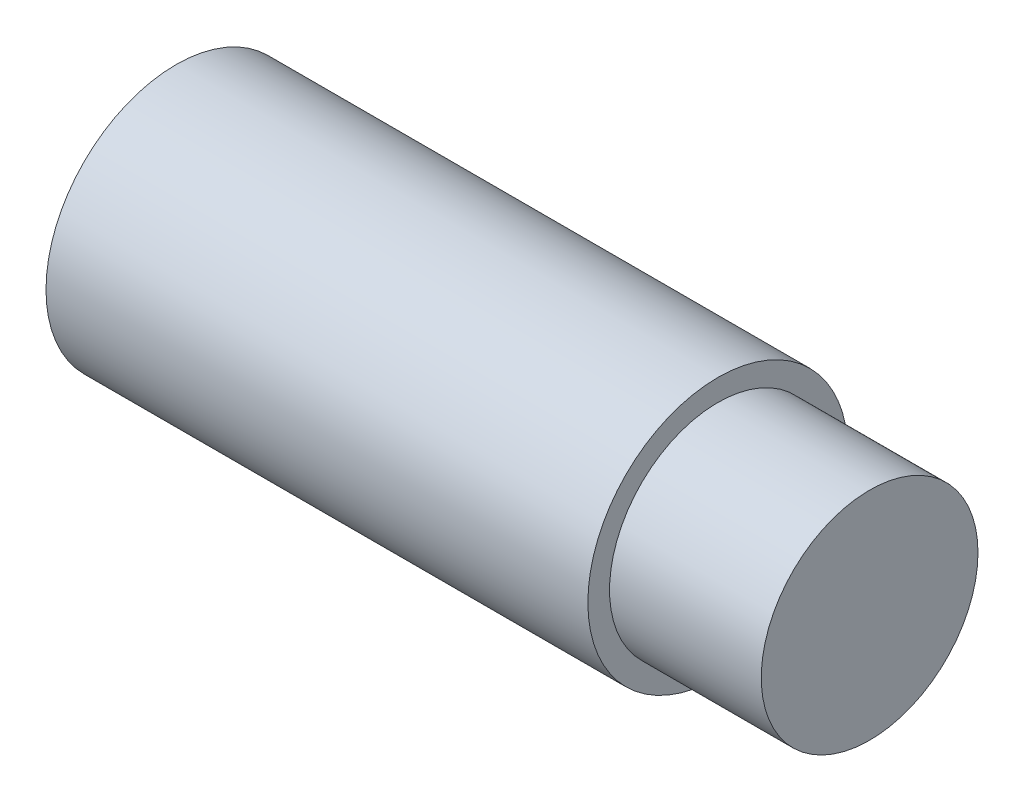
ISO-10303-21;
HEADER;
FILE_DESCRIPTION(('STEP AP214'),'2;1');
FILE_NAME('part.step','',(''),(''),'','','');
FILE_SCHEMA(('AUTOMOTIVE_DESIGN { 1 0 10303 214 1 1 1 1 }'));
ENDSEC;
DATA;
#1=APPLICATION_CONTEXT('core data for automotive mechanical design processes');
#2=APPLICATION_PROTOCOL_DEFINITION('international standard','automotive_design',2000,#1);
#3=PRODUCT_CONTEXT('',#1,'mechanical');
#4=PRODUCT('Part','Part','',(#3));
#5=PRODUCT_RELATED_PRODUCT_CATEGORY('part','',(#4));
#6=PRODUCT_DEFINITION_FORMATION('','',#4);
#7=PRODUCT_DEFINITION_CONTEXT('part definition',#1,'design');
#8=PRODUCT_DEFINITION('design','',#6,#7);
#9=PRODUCT_DEFINITION_SHAPE('','',#8);
#10=(LENGTH_UNIT() NAMED_UNIT(*) SI_UNIT(.MILLI.,.METRE.));
#11=(NAMED_UNIT(*) PLANE_ANGLE_UNIT() SI_UNIT($,.RADIAN.));
#12=(NAMED_UNIT(*) SI_UNIT($,.STERADIAN.) SOLID_ANGLE_UNIT());
#13=UNCERTAINTY_MEASURE_WITH_UNIT(LENGTH_MEASURE(1.E-05),#10,'distance_accuracy_value','');
#14=(GEOMETRIC_REPRESENTATION_CONTEXT(3) GLOBAL_UNCERTAINTY_ASSIGNED_CONTEXT((#13)) GLOBAL_UNIT_ASSIGNED_CONTEXT((#10,
#11,#12)) REPRESENTATION_CONTEXT('',''));
#15=CARTESIAN_POINT('',(0.,0.,0.));
#16=DIRECTION('',(0.,0.,1.));
#17=DIRECTION('',(1.,0.,0.));
#18=AXIS2_PLACEMENT_3D('',#15,#16,#17);
#19=CARTESIAN_POINT('',(25.,0.,0.));
#20=DIRECTION('',(1.,0.,0.));
#21=DIRECTION('',(0.,0.,-1.));
#22=AXIS2_PLACEMENT_3D('',#19,#20,#21);
#23=PLANE('',#22);
#24=CARTESIAN_POINT('',(25.,0.,0.));
#25=DIRECTION('',(1.,0.,0.));
#26=DIRECTION('',(0.,0.,-1.));
#27=AXIS2_PLACEMENT_3D('',#24,#25,#26);
#28=CIRCLE('',#27,12.);
#29=CARTESIAN_POINT('',(25.,0.,-12.));
#30=VERTEX_POINT('',#29);
#31=EDGE_CURVE('E10',#30,#30,#28,.T.);
#32=ORIENTED_EDGE('',*,*,#31,.T.);
#33=EDGE_LOOP('',(#32));
#34=FACE_BOUND('',#33,.T.);
#35=CARTESIAN_POINT('',(25.,0.,0.));
#36=DIRECTION('',(1.,0.,0.));
#37=DIRECTION('',(0.,0.,-1.));
#38=AXIS2_PLACEMENT_3D('',#35,#36,#37);
#39=CIRCLE('',#38,10.);
#40=CARTESIAN_POINT('',(25.,0.,-10.));
#41=VERTEX_POINT('',#40);
#42=EDGE_CURVE('E29',#41,#41,#39,.T.);
#43=ORIENTED_EDGE('',*,*,#42,.F.);
#44=EDGE_LOOP('',(#43));
#45=FACE_BOUND('',#44,.T.);
#46=ADVANCED_FACE('F15',(#34,#45),#23,.T.);
#47=CARTESIAN_POINT('',(25.,0.,0.));
#48=DIRECTION('',(-1.,0.,0.));
#49=DIRECTION('',(0.,0.,1.));
#50=AXIS2_PLACEMENT_3D('',#47,#48,#49);
#51=CYLINDRICAL_SURFACE('',#50,12.);
#52=ORIENTED_EDGE('',*,*,#31,.F.);
#53=EDGE_LOOP('',(#52));
#54=FACE_BOUND('',#53,.T.);
#55=CARTESIAN_POINT('',(-25.,0.,0.));
#56=DIRECTION('',(1.,0.,0.));
#57=DIRECTION('',(0.,0.,-1.));
#58=AXIS2_PLACEMENT_3D('',#55,#56,#57);
#59=CIRCLE('',#58,12.);
#60=CARTESIAN_POINT('',(-25.,0.,-12.));
#61=VERTEX_POINT('',#60);
#62=EDGE_CURVE('E19',#61,#61,#59,.T.);
#63=ORIENTED_EDGE('',*,*,#62,.T.);
#64=EDGE_LOOP('',(#63));
#65=FACE_BOUND('',#64,.T.);
#66=ADVANCED_FACE('F17',(#54,#65),#51,.T.);
#67=CARTESIAN_POINT('',(-25.,0.,0.));
#68=DIRECTION('',(1.,0.,0.));
#69=DIRECTION('',(0.,0.,-1.));
#70=AXIS2_PLACEMENT_3D('',#67,#68,#69);
#71=PLANE('',#70);
#72=ORIENTED_EDGE('',*,*,#62,.F.);
#73=EDGE_LOOP('',(#72));
#74=FACE_BOUND('',#73,.T.);
#75=ADVANCED_FACE('F40',(#74),#71,.F.);
#76=CARTESIAN_POINT('',(39.,0.,0.));
#77=DIRECTION('',(-1.,0.,0.));
#78=DIRECTION('',(0.,0.,1.));
#79=AXIS2_PLACEMENT_3D('',#76,#77,#78);
#80=CYLINDRICAL_SURFACE('',#79,10.);
#81=CARTESIAN_POINT('',(39.,0.,0.));
#82=DIRECTION('',(1.,0.,0.));
#83=DIRECTION('',(0.,0.,-1.));
#84=AXIS2_PLACEMENT_3D('',#81,#82,#83);
#85=CIRCLE('',#84,10.);
#86=CARTESIAN_POINT('',(39.,0.,-10.));
#87=VERTEX_POINT('',#86);
#88=EDGE_CURVE('E27',#87,#87,#85,.T.);
#89=ORIENTED_EDGE('',*,*,#88,.F.);
#90=EDGE_LOOP('',(#89));
#91=FACE_BOUND('',#90,.T.);
#92=ORIENTED_EDGE('',*,*,#42,.T.);
#93=EDGE_LOOP('',(#92));
#94=FACE_BOUND('',#93,.T.);
#95=ADVANCED_FACE('F37',(#91,#94),#80,.T.);
#96=CARTESIAN_POINT('',(39.,0.,0.));
#97=DIRECTION('',(1.,0.,0.));
#98=DIRECTION('',(0.,0.,-1.));
#99=AXIS2_PLACEMENT_3D('',#96,#97,#98);
#100=PLANE('',#99);
#101=ORIENTED_EDGE('',*,*,#88,.T.);
#102=EDGE_LOOP('',(#101));
#103=FACE_BOUND('',#102,.T.);
#104=ADVANCED_FACE('F35',(#103),#100,.T.);
#105=CLOSED_SHELL('',(#46,#66,#75,#95,#104));
#106=MANIFOLD_SOLID_BREP('B1',#105);
#107=ADVANCED_BREP_SHAPE_REPRESENTATION('',(#18,#106),#14);
#108=SHAPE_DEFINITION_REPRESENTATION(#9,#107);
ENDSEC;
END-ISO-10303-21;
